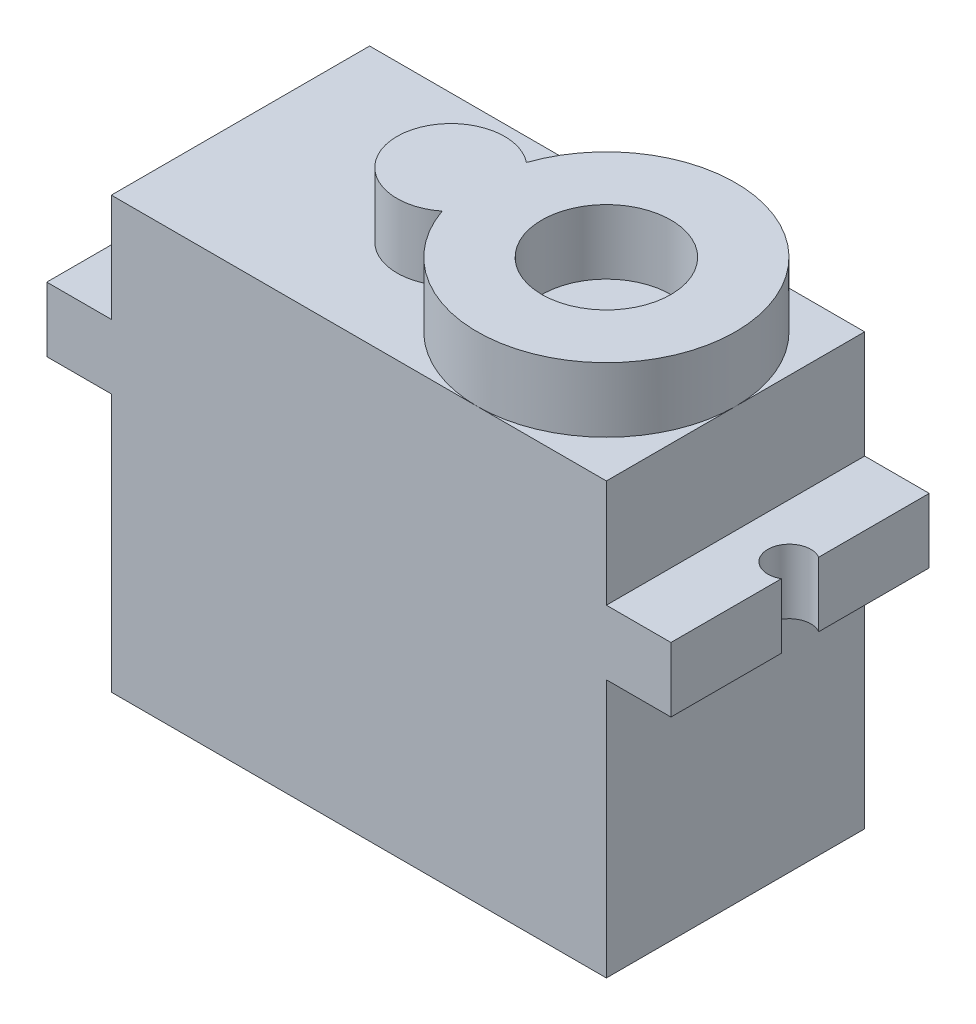
ISO-10303-21;
HEADER;
FILE_DESCRIPTION(('STEP AP214'),'2;1');
FILE_NAME('part.step','',(''),(''),'','','');
FILE_SCHEMA(('AUTOMOTIVE_DESIGN { 1 0 10303 214 1 1 1 1 }'));
ENDSEC;
DATA;
#1=APPLICATION_CONTEXT('core data for automotive mechanical design processes');
#2=APPLICATION_PROTOCOL_DEFINITION('international standard','automotive_design',2000,#1);
#3=PRODUCT_CONTEXT('',#1,'mechanical');
#4=PRODUCT('Part','Part','',(#3));
#5=PRODUCT_RELATED_PRODUCT_CATEGORY('part','',(#4));
#6=PRODUCT_DEFINITION_FORMATION('','',#4);
#7=PRODUCT_DEFINITION_CONTEXT('part definition',#1,'design');
#8=PRODUCT_DEFINITION('design','',#6,#7);
#9=PRODUCT_DEFINITION_SHAPE('','',#8);
#10=(LENGTH_UNIT() NAMED_UNIT(*) SI_UNIT(.MILLI.,.METRE.));
#11=(NAMED_UNIT(*) PLANE_ANGLE_UNIT() SI_UNIT($,.RADIAN.));
#12=(NAMED_UNIT(*) SI_UNIT($,.STERADIAN.) SOLID_ANGLE_UNIT());
#13=UNCERTAINTY_MEASURE_WITH_UNIT(LENGTH_MEASURE(1.E-05),#10,'distance_accuracy_value','');
#14=(GEOMETRIC_REPRESENTATION_CONTEXT(3) GLOBAL_UNCERTAINTY_ASSIGNED_CONTEXT((#13)) GLOBAL_UNIT_ASSIGNED_CONTEXT((#10,
#11,#12)) REPRESENTATION_CONTEXT('',''));
#15=CARTESIAN_POINT('',(0.,0.,0.));
#16=DIRECTION('',(0.,0.,1.));
#17=DIRECTION('',(1.,0.,0.));
#18=AXIS2_PLACEMENT_3D('',#15,#16,#17);
#19=CARTESIAN_POINT('',(0.,8.,6.));
#20=DIRECTION('',(0.,1.,0.));
#21=DIRECTION('',(0.,0.,1.));
#22=AXIS2_PLACEMENT_3D('',#19,#20,#21);
#23=PLANE('',#22);
#24=CARTESIAN_POINT('',(-1.72651780580471,8.,0.));
#25=DIRECTION('',(0.,1.,0.));
#26=DIRECTION('',(0.,0.,1.));
#27=AXIS2_PLACEMENT_3D('',#24,#25,#26);
#28=CIRCLE('',#27,2.5);
#29=CARTESIAN_POINT('',(-0.171650011833363,8.,-1.9576481152829));
#30=VERTEX_POINT('',#29);
#31=CARTESIAN_POINT('',(-0.171650011833363,8.,1.95764811528289));
#32=VERTEX_POINT('',#31);
#33=EDGE_CURVE('E198',#30,#32,#28,.T.);
#34=ORIENTED_EDGE('',*,*,#33,.F.);
#35=CARTESIAN_POINT('',(5.5,8.,0.));
#36=DIRECTION('',(0.,1.,0.));
#37=DIRECTION('',(0.,0.,1.));
#38=AXIS2_PLACEMENT_3D('',#35,#36,#37);
#39=CIRCLE('',#38,6.);
#40=CARTESIAN_POINT('',(5.5,8.,-6.));
#41=VERTEX_POINT('',#40);
#42=EDGE_CURVE('E422',#41,#30,#39,.T.);
#43=ORIENTED_EDGE('',*,*,#42,.F.);
#44=DIRECTION('',(1.,0.,0.));
#45=VECTOR('',#44,1.);
#46=CARTESIAN_POINT('',(0.,8.,-6.));
#47=LINE('',#46,#45);
#48=CARTESIAN_POINT('',(-11.5,8.,-6.));
#49=VERTEX_POINT('',#48);
#50=EDGE_CURVE('E352',#49,#41,#47,.T.);
#51=ORIENTED_EDGE('',*,*,#50,.F.);
#52=DIRECTION('',(0.,0.,-1.));
#53=VECTOR('',#52,1.);
#54=CARTESIAN_POINT('',(-11.5,8.,6.));
#55=LINE('',#54,#53);
#56=CARTESIAN_POINT('',(-11.5,8.,6.));
#57=VERTEX_POINT('',#56);
#58=EDGE_CURVE('E393',#57,#49,#55,.T.);
#59=ORIENTED_EDGE('',*,*,#58,.F.);
#60=DIRECTION('',(1.,0.,0.));
#61=VECTOR('',#60,1.);
#62=CARTESIAN_POINT('',(0.,8.,6.));
#63=LINE('',#62,#61);
#64=CARTESIAN_POINT('',(5.5,8.,6.));
#65=VERTEX_POINT('',#64);
#66=EDGE_CURVE('E312',#57,#65,#63,.T.);
#67=ORIENTED_EDGE('',*,*,#66,.T.);
#68=EDGE_CURVE('E53',#32,#65,#39,.T.);
#69=ORIENTED_EDGE('',*,*,#68,.F.);
#70=EDGE_LOOP('',(#34,#43,#51,#59,#67,#69));
#71=FACE_BOUND('',#70,.T.);
#72=ADVANCED_FACE('F41',(#71),#23,.T.);
#73=CARTESIAN_POINT('',(11.5,8.,0.));
#74=VERTEX_POINT('',#73);
#75=EDGE_CURVE('E11',#65,#74,#39,.T.);
#76=ORIENTED_EDGE('',*,*,#75,.F.);
#77=CARTESIAN_POINT('',(11.5,8.,6.));
#78=VERTEX_POINT('',#77);
#79=EDGE_CURVE('E311',#65,#78,#63,.T.);
#80=ORIENTED_EDGE('',*,*,#79,.T.);
#81=DIRECTION('',(0.,0.,-1.));
#82=VECTOR('',#81,1.);
#83=CARTESIAN_POINT('',(11.5,8.,6.));
#84=LINE('',#83,#82);
#85=EDGE_CURVE('E397',#78,#74,#84,.T.);
#86=ORIENTED_EDGE('',*,*,#85,.T.);
#87=EDGE_LOOP('',(#76,#80,#86));
#88=FACE_BOUND('',#87,.T.);
#89=ADVANCED_FACE('F452',(#88),#23,.T.);
#90=CARTESIAN_POINT('',(14.5,0.,6.));
#91=DIRECTION('',(-1.,0.,0.));
#92=DIRECTION('',(0.,-1.,0.));
#93=AXIS2_PLACEMENT_3D('',#90,#91,#92);
#94=PLANE('',#93);
#95=DIRECTION('',(0.,0.,-1.));
#96=VECTOR('',#95,1.);
#97=CARTESIAN_POINT('',(14.5,0.,6.));
#98=LINE('',#97,#96);
#99=CARTESIAN_POINT('',(14.5,0.,6.));
#100=VERTEX_POINT('',#99);
#101=CARTESIAN_POINT('',(14.5,0.,0.866025403784438));
#102=VERTEX_POINT('',#101);
#103=EDGE_CURVE('E410',#100,#102,#98,.T.);
#104=ORIENTED_EDGE('',*,*,#103,.T.);
#105=DIRECTION('',(0.,1.,0.));
#106=VECTOR('',#105,1.);
#107=CARTESIAN_POINT('',(14.5,-12.,0.866025403784434));
#108=LINE('',#107,#106);
#109=CARTESIAN_POINT('',(14.5,2.99999999999999,0.866025403784439));
#110=VERTEX_POINT('',#109);
#111=EDGE_CURVE('E285',#102,#110,#108,.T.);
#112=ORIENTED_EDGE('',*,*,#111,.T.);
#113=DIRECTION('',(0.,0.,-1.));
#114=VECTOR('',#113,1.);
#115=CARTESIAN_POINT('',(14.5,2.99999999999999,6.));
#116=LINE('',#115,#114);
#117=CARTESIAN_POINT('',(14.5,2.99999999999999,6.));
#118=VERTEX_POINT('',#117);
#119=EDGE_CURVE('E405',#118,#110,#116,.T.);
#120=ORIENTED_EDGE('',*,*,#119,.F.);
#121=DIRECTION('',(0.,1.,0.));
#122=VECTOR('',#121,1.);
#123=CARTESIAN_POINT('',(14.5,0.,6.));
#124=LINE('',#123,#122);
#125=EDGE_CURVE('E298',#100,#118,#124,.T.);
#126=ORIENTED_EDGE('',*,*,#125,.F.);
#127=EDGE_LOOP('',(#104,#112,#120,#126));
#128=FACE_BOUND('',#127,.T.);
#129=ADVANCED_FACE('F459',(#128),#94,.F.);
#130=CARTESIAN_POINT('',(-14.5,0.,6.));
#131=DIRECTION('',(-1.,0.,0.));
#132=DIRECTION('',(0.,-1.,0.));
#133=AXIS2_PLACEMENT_3D('',#130,#131,#132);
#134=PLANE('',#133);
#135=DIRECTION('',(0.,1.,0.));
#136=VECTOR('',#135,1.);
#137=CARTESIAN_POINT('',(-14.5,-12.,0.866025403784434));
#138=LINE('',#137,#136);
#139=CARTESIAN_POINT('',(-14.5,0.,0.866025403784438));
#140=VERTEX_POINT('',#139);
#141=CARTESIAN_POINT('',(-14.5,2.99999999999999,0.866025403784439));
#142=VERTEX_POINT('',#141);
#143=EDGE_CURVE('E274',#140,#142,#138,.T.);
#144=ORIENTED_EDGE('',*,*,#143,.F.);
#145=DIRECTION('',(0.,0.,-1.));
#146=VECTOR('',#145,1.);
#147=CARTESIAN_POINT('',(-14.5,0.,6.));
#148=LINE('',#147,#146);
#149=CARTESIAN_POINT('',(-14.5,0.,6.));
#150=VERTEX_POINT('',#149);
#151=EDGE_CURVE('E381',#150,#140,#148,.T.);
#152=ORIENTED_EDGE('',*,*,#151,.F.);
#153=DIRECTION('',(0.,1.,0.));
#154=VECTOR('',#153,1.);
#155=CARTESIAN_POINT('',(-14.5,0.,6.));
#156=LINE('',#155,#154);
#157=CARTESIAN_POINT('',(-14.5,2.99999999999999,6.));
#158=VERTEX_POINT('',#157);
#159=EDGE_CURVE('E319',#150,#158,#156,.T.);
#160=ORIENTED_EDGE('',*,*,#159,.T.);
#161=DIRECTION('',(0.,0.,-1.));
#162=VECTOR('',#161,1.);
#163=CARTESIAN_POINT('',(-14.5,2.99999999999999,6.));
#164=LINE('',#163,#162);
#165=EDGE_CURVE('E386',#158,#142,#164,.T.);
#166=ORIENTED_EDGE('',*,*,#165,.T.);
#167=EDGE_LOOP('',(#144,#152,#160,#166));
#168=FACE_BOUND('',#167,.T.);
#169=ADVANCED_FACE('F491',(#168),#134,.T.);
#170=CARTESIAN_POINT('',(11.5,0.,6.));
#171=DIRECTION('',(1.,0.,0.));
#172=DIRECTION('',(0.,0.,-1.));
#173=AXIS2_PLACEMENT_3D('',#170,#171,#172);
#174=PLANE('',#173);
#175=DIRECTION('',(0.,-1.,0.));
#176=VECTOR('',#175,1.);
#177=CARTESIAN_POINT('',(11.5,0.,-6.));
#178=LINE('',#177,#176);
#179=CARTESIAN_POINT('',(11.5,0.,-6.));
#180=VERTEX_POINT('',#179);
#181=CARTESIAN_POINT('',(11.5,-12.,-6.));
#182=VERTEX_POINT('',#181);
#183=EDGE_CURVE('E289',#180,#182,#178,.T.);
#184=ORIENTED_EDGE('',*,*,#183,.F.);
#185=DIRECTION('',(0.,0.,-1.));
#186=VECTOR('',#185,1.);
#187=CARTESIAN_POINT('',(11.5,0.,6.));
#188=LINE('',#187,#186);
#189=CARTESIAN_POINT('',(11.5,0.,6.));
#190=VERTEX_POINT('',#189);
#191=EDGE_CURVE('E414',#190,#180,#188,.T.);
#192=ORIENTED_EDGE('',*,*,#191,.F.);
#193=DIRECTION('',(0.,-1.,0.));
#194=VECTOR('',#193,1.);
#195=CARTESIAN_POINT('',(11.5,0.,6.));
#196=LINE('',#195,#194);
#197=CARTESIAN_POINT('',(11.5,-12.,6.));
#198=VERTEX_POINT('',#197);
#199=EDGE_CURVE('E290',#190,#198,#196,.T.);
#200=ORIENTED_EDGE('',*,*,#199,.T.);
#201=DIRECTION('',(0.,0.,-1.));
#202=VECTOR('',#201,1.);
#203=CARTESIAN_POINT('',(11.5,-12.,6.));
#204=LINE('',#203,#202);
#205=EDGE_CURVE('E329',#198,#182,#204,.T.);
#206=ORIENTED_EDGE('',*,*,#205,.T.);
#207=EDGE_LOOP('',(#184,#192,#200,#206));
#208=FACE_BOUND('',#207,.T.);
#209=ADVANCED_FACE('F43',(#208),#174,.T.);
#210=CARTESIAN_POINT('',(0.,0.,6.));
#211=DIRECTION('',(0.,1.,0.));
#212=DIRECTION('',(-1.,0.,0.));
#213=AXIS2_PLACEMENT_3D('',#210,#211,#212);
#214=PLANE('',#213);
#215=CARTESIAN_POINT('',(14.5,0.,-0.866025403784434));
#216=VERTEX_POINT('',#215);
#217=CARTESIAN_POINT('',(14.5,0.,-6.));
#218=VERTEX_POINT('',#217);
#219=EDGE_CURVE('E409',#216,#218,#98,.T.);
#220=ORIENTED_EDGE('',*,*,#219,.F.);
#221=CARTESIAN_POINT('',(14.,0.,0.));
#222=DIRECTION('',(0.,1.,0.));
#223=DIRECTION('',(-1.,0.,0.));
#224=AXIS2_PLACEMENT_3D('',#221,#222,#223);
#225=CIRCLE('',#224,1.);
#226=EDGE_CURVE('E281',#216,#102,#225,.T.);
#227=ORIENTED_EDGE('',*,*,#226,.T.);
#228=ORIENTED_EDGE('',*,*,#103,.F.);
#229=DIRECTION('',(1.,0.,0.));
#230=VECTOR('',#229,1.);
#231=CARTESIAN_POINT('',(0.,0.,6.));
#232=LINE('',#231,#230);
#233=EDGE_CURVE('E294',#190,#100,#232,.T.);
#234=ORIENTED_EDGE('',*,*,#233,.F.);
#235=ORIENTED_EDGE('',*,*,#191,.T.);
#236=DIRECTION('',(1.,0.,0.));
#237=VECTOR('',#236,1.);
#238=CARTESIAN_POINT('',(0.,0.,-6.));
#239=LINE('',#238,#237);
#240=EDGE_CURVE('E333',#180,#218,#239,.T.);
#241=ORIENTED_EDGE('',*,*,#240,.T.);
#242=EDGE_LOOP('',(#220,#227,#228,#234,#235,#241));
#243=FACE_BOUND('',#242,.T.);
#244=ADVANCED_FACE('F481',(#243),#214,.F.);
#245=CARTESIAN_POINT('',(14.5,2.99999999999999,-0.866025403784439));
#246=VERTEX_POINT('',#245);
#247=CARTESIAN_POINT('',(14.5,2.99999999999999,-6.));
#248=VERTEX_POINT('',#247);
#249=EDGE_CURVE('E404',#246,#248,#116,.T.);
#250=ORIENTED_EDGE('',*,*,#249,.F.);
#251=DIRECTION('',(0.,1.,0.));
#252=VECTOR('',#251,1.);
#253=CARTESIAN_POINT('',(14.5,-12.,-0.866025403784434));
#254=LINE('',#253,#252);
#255=EDGE_CURVE('E277',#246,#216,#254,.F.);
#256=ORIENTED_EDGE('',*,*,#255,.T.);
#257=ORIENTED_EDGE('',*,*,#219,.T.);
#258=DIRECTION('',(0.,1.,0.));
#259=VECTOR('',#258,1.);
#260=CARTESIAN_POINT('',(14.5,0.,-6.));
#261=LINE('',#260,#259);
#262=EDGE_CURVE('E337',#218,#248,#261,.T.);
#263=ORIENTED_EDGE('',*,*,#262,.T.);
#264=EDGE_LOOP('',(#250,#256,#257,#263));
#265=FACE_BOUND('',#264,.T.);
#266=ADVANCED_FACE('F477',(#265),#94,.F.);
#267=CARTESIAN_POINT('',(0.,2.99999999999999,6.));
#268=DIRECTION('',(0.,1.,0.));
#269=DIRECTION('',(0.,0.,1.));
#270=AXIS2_PLACEMENT_3D('',#267,#268,#269);
#271=PLANE('',#270);
#272=CARTESIAN_POINT('',(14.,2.99999999999999,0.));
#273=DIRECTION('',(0.,1.,0.));
#274=DIRECTION('',(0.,0.,1.));
#275=AXIS2_PLACEMENT_3D('',#272,#273,#274);
#276=CIRCLE('',#275,1.);
#277=EDGE_CURVE('E45',#246,#110,#276,.T.);
#278=ORIENTED_EDGE('',*,*,#277,.F.);
#279=ORIENTED_EDGE('',*,*,#249,.T.);
#280=DIRECTION('',(1.,0.,0.));
#281=VECTOR('',#280,1.);
#282=CARTESIAN_POINT('',(0.,2.99999999999999,-6.));
#283=LINE('',#282,#281);
#284=CARTESIAN_POINT('',(11.5,2.99999999999999,-6.));
#285=VERTEX_POINT('',#284);
#286=EDGE_CURVE('E342',#285,#248,#283,.T.);
#287=ORIENTED_EDGE('',*,*,#286,.F.);
#288=DIRECTION('',(0.,0.,-1.));
#289=VECTOR('',#288,1.);
#290=CARTESIAN_POINT('',(11.5,2.99999999999999,6.));
#291=LINE('',#290,#289);
#292=CARTESIAN_POINT('',(11.5,2.99999999999999,6.));
#293=VERTEX_POINT('',#292);
#294=EDGE_CURVE('E401',#293,#285,#291,.T.);
#295=ORIENTED_EDGE('',*,*,#294,.F.);
#296=DIRECTION('',(1.,0.,0.));
#297=VECTOR('',#296,1.);
#298=CARTESIAN_POINT('',(0.,2.99999999999999,6.));
#299=LINE('',#298,#297);
#300=EDGE_CURVE('E302',#293,#118,#299,.T.);
#301=ORIENTED_EDGE('',*,*,#300,.T.);
#302=ORIENTED_EDGE('',*,*,#119,.T.);
#303=EDGE_LOOP('',(#278,#279,#287,#295,#301,#302));
#304=FACE_BOUND('',#303,.T.);
#305=ADVANCED_FACE('F472',(#304),#271,.T.);
#306=CARTESIAN_POINT('',(11.5,0.,6.));
#307=DIRECTION('',(-1.,0.,0.));
#308=DIRECTION('',(0.,0.,1.));
#309=AXIS2_PLACEMENT_3D('',#306,#307,#308);
#310=PLANE('',#309);
#311=DIRECTION('',(0.,1.,0.));
#312=VECTOR('',#311,1.);
#313=CARTESIAN_POINT('',(11.5,0.,-6.));
#314=LINE('',#313,#312);
#315=CARTESIAN_POINT('',(11.5,8.,-6.));
#316=VERTEX_POINT('',#315);
#317=EDGE_CURVE('E346',#285,#316,#314,.T.);
#318=ORIENTED_EDGE('',*,*,#317,.T.);
#319=EDGE_CURVE('E396',#74,#316,#84,.T.);
#320=ORIENTED_EDGE('',*,*,#319,.F.);
#321=ORIENTED_EDGE('',*,*,#85,.F.);
#322=DIRECTION('',(0.,1.,0.));
#323=VECTOR('',#322,1.);
#324=CARTESIAN_POINT('',(11.5,0.,6.));
#325=LINE('',#324,#323);
#326=EDGE_CURVE('E306',#293,#78,#325,.T.);
#327=ORIENTED_EDGE('',*,*,#326,.F.);
#328=ORIENTED_EDGE('',*,*,#294,.T.);
#329=EDGE_LOOP('',(#318,#320,#321,#327,#328));
#330=FACE_BOUND('',#329,.T.);
#331=ADVANCED_FACE('F465',(#330),#310,.F.);
#332=EDGE_CURVE('E51',#74,#41,#39,.T.);
#333=ORIENTED_EDGE('',*,*,#332,.F.);
#334=ORIENTED_EDGE('',*,*,#319,.T.);
#335=EDGE_CURVE('E351',#41,#316,#47,.T.);
#336=ORIENTED_EDGE('',*,*,#335,.F.);
#337=EDGE_LOOP('',(#333,#334,#336));
#338=FACE_BOUND('',#337,.T.);
#339=ADVANCED_FACE('F451',(#338),#23,.T.);
#340=CARTESIAN_POINT('',(-11.5,0.,6.));
#341=DIRECTION('',(-1.,0.,0.));
#342=DIRECTION('',(0.,0.,1.));
#343=AXIS2_PLACEMENT_3D('',#340,#341,#342);
#344=PLANE('',#343);
#345=DIRECTION('',(0.,1.,0.));
#346=VECTOR('',#345,1.);
#347=CARTESIAN_POINT('',(-11.5,0.,-6.));
#348=LINE('',#347,#346);
#349=CARTESIAN_POINT('',(-11.5,2.99999999999999,-6.));
#350=VERTEX_POINT('',#349);
#351=EDGE_CURVE('E356',#350,#49,#348,.T.);
#352=ORIENTED_EDGE('',*,*,#351,.F.);
#353=DIRECTION('',(0.,0.,-1.));
#354=VECTOR('',#353,1.);
#355=CARTESIAN_POINT('',(-11.5,2.99999999999999,6.));
#356=LINE('',#355,#354);
#357=CARTESIAN_POINT('',(-11.5,2.99999999999999,6.));
#358=VERTEX_POINT('',#357);
#359=EDGE_CURVE('E390',#358,#350,#356,.T.);
#360=ORIENTED_EDGE('',*,*,#359,.F.);
#361=DIRECTION('',(0.,1.,0.));
#362=VECTOR('',#361,1.);
#363=CARTESIAN_POINT('',(-11.5,0.,6.));
#364=LINE('',#363,#362);
#365=EDGE_CURVE('E315',#358,#57,#364,.T.);
#366=ORIENTED_EDGE('',*,*,#365,.T.);
#367=ORIENTED_EDGE('',*,*,#58,.T.);
#368=EDGE_LOOP('',(#352,#360,#366,#367));
#369=FACE_BOUND('',#368,.T.);
#370=ADVANCED_FACE('F464',(#369),#344,.T.);
#371=CARTESIAN_POINT('',(-14.,2.99999999999999,0.));
#372=DIRECTION('',(0.,1.,0.));
#373=DIRECTION('',(0.,0.,-1.));
#374=AXIS2_PLACEMENT_3D('',#371,#372,#373);
#375=CIRCLE('',#374,1.);
#376=CARTESIAN_POINT('',(-14.5,2.99999999999999,-0.866025403784439));
#377=VERTEX_POINT('',#376);
#378=EDGE_CURVE('E265',#142,#377,#375,.T.);
#379=ORIENTED_EDGE('',*,*,#378,.F.);
#380=ORIENTED_EDGE('',*,*,#165,.F.);
#381=EDGE_CURVE('E307',#158,#358,#299,.T.);
#382=ORIENTED_EDGE('',*,*,#381,.T.);
#383=ORIENTED_EDGE('',*,*,#359,.T.);
#384=CARTESIAN_POINT('',(-14.5,2.99999999999999,-6.));
#385=VERTEX_POINT('',#384);
#386=EDGE_CURVE('E347',#385,#350,#283,.T.);
#387=ORIENTED_EDGE('',*,*,#386,.F.);
#388=EDGE_CURVE('E385',#377,#385,#164,.T.);
#389=ORIENTED_EDGE('',*,*,#388,.F.);
#390=EDGE_LOOP('',(#379,#380,#382,#383,#387,#389));
#391=FACE_BOUND('',#390,.T.);
#392=ADVANCED_FACE('F470',(#391),#271,.T.);
#393=DIRECTION('',(0.,1.,0.));
#394=VECTOR('',#393,1.);
#395=CARTESIAN_POINT('',(-14.5,-12.,-0.866025403784434));
#396=LINE('',#395,#394);
#397=CARTESIAN_POINT('',(-14.5,0.,-0.866025403784438));
#398=VERTEX_POINT('',#397);
#399=EDGE_CURVE('E271',#377,#398,#396,.F.);
#400=ORIENTED_EDGE('',*,*,#399,.F.);
#401=ORIENTED_EDGE('',*,*,#388,.T.);
#402=DIRECTION('',(0.,1.,0.));
#403=VECTOR('',#402,1.);
#404=CARTESIAN_POINT('',(-14.5,0.,-6.));
#405=LINE('',#404,#403);
#406=CARTESIAN_POINT('',(-14.5,0.,-6.));
#407=VERTEX_POINT('',#406);
#408=EDGE_CURVE('E360',#407,#385,#405,.T.);
#409=ORIENTED_EDGE('',*,*,#408,.F.);
#410=EDGE_CURVE('E380',#398,#407,#148,.T.);
#411=ORIENTED_EDGE('',*,*,#410,.F.);
#412=EDGE_LOOP('',(#400,#401,#409,#411));
#413=FACE_BOUND('',#412,.T.);
#414=ADVANCED_FACE('F498',(#413),#134,.T.);
#415=ORIENTED_EDGE('',*,*,#151,.T.);
#416=CARTESIAN_POINT('',(-14.,0.,0.));
#417=DIRECTION('',(0.,1.,0.));
#418=DIRECTION('',(-1.,0.,0.));
#419=AXIS2_PLACEMENT_3D('',#416,#417,#418);
#420=CIRCLE('',#419,1.);
#421=EDGE_CURVE('E416',#140,#398,#420,.T.);
#422=ORIENTED_EDGE('',*,*,#421,.T.);
#423=ORIENTED_EDGE('',*,*,#410,.T.);
#424=CARTESIAN_POINT('',(-11.5,0.,-6.));
#425=VERTEX_POINT('',#424);
#426=EDGE_CURVE('E338',#407,#425,#239,.T.);
#427=ORIENTED_EDGE('',*,*,#426,.T.);
#428=DIRECTION('',(0.,0.,-1.));
#429=VECTOR('',#428,1.);
#430=CARTESIAN_POINT('',(-11.5,0.,6.));
#431=LINE('',#430,#429);
#432=CARTESIAN_POINT('',(-11.5,0.,6.));
#433=VERTEX_POINT('',#432);
#434=EDGE_CURVE('E376',#433,#425,#431,.T.);
#435=ORIENTED_EDGE('',*,*,#434,.F.);
#436=EDGE_CURVE('E299',#150,#433,#232,.T.);
#437=ORIENTED_EDGE('',*,*,#436,.F.);
#438=EDGE_LOOP('',(#415,#422,#423,#427,#435,#437));
#439=FACE_BOUND('',#438,.T.);
#440=ADVANCED_FACE('F488',(#439),#214,.F.);
#441=CARTESIAN_POINT('',(-11.5,0.,6.));
#442=DIRECTION('',(1.,0.,0.));
#443=DIRECTION('',(0.,0.,-1.));
#444=AXIS2_PLACEMENT_3D('',#441,#442,#443);
#445=PLANE('',#444);
#446=DIRECTION('',(0.,-1.,0.));
#447=VECTOR('',#446,1.);
#448=CARTESIAN_POINT('',(-11.5,0.,-6.));
#449=LINE('',#448,#447);
#450=CARTESIAN_POINT('',(-11.5,-12.,-6.));
#451=VERTEX_POINT('',#450);
#452=EDGE_CURVE('E364',#425,#451,#449,.T.);
#453=ORIENTED_EDGE('',*,*,#452,.T.);
#454=DIRECTION('',(0.,0.,-1.));
#455=VECTOR('',#454,1.);
#456=CARTESIAN_POINT('',(-11.5,-12.,6.));
#457=LINE('',#456,#455);
#458=CARTESIAN_POINT('',(-11.5,-12.,6.));
#459=VERTEX_POINT('',#458);
#460=EDGE_CURVE('E372',#459,#451,#457,.T.);
#461=ORIENTED_EDGE('',*,*,#460,.F.);
#462=DIRECTION('',(0.,-1.,0.));
#463=VECTOR('',#462,1.);
#464=CARTESIAN_POINT('',(-11.5,0.,6.));
#465=LINE('',#464,#463);
#466=EDGE_CURVE('E323',#433,#459,#465,.T.);
#467=ORIENTED_EDGE('',*,*,#466,.F.);
#468=ORIENTED_EDGE('',*,*,#434,.T.);
#469=EDGE_LOOP('',(#453,#461,#467,#468));
#470=FACE_BOUND('',#469,.T.);
#471=ADVANCED_FACE('F542',(#470),#445,.F.);
#472=CARTESIAN_POINT('',(0.,-12.,6.));
#473=DIRECTION('',(0.,1.,0.));
#474=DIRECTION('',(-1.,0.,0.));
#475=AXIS2_PLACEMENT_3D('',#472,#473,#474);
#476=PLANE('',#475);
#477=CARTESIAN_POINT('',(9.5,-12.,4.));
#478=DIRECTION('',(0.,-1.,0.));
#479=DIRECTION('',(-1.,0.,0.));
#480=AXIS2_PLACEMENT_3D('',#477,#478,#479);
#481=CIRCLE('',#480,1.25);
#482=CARTESIAN_POINT('',(8.25,-12.,4.));
#483=VERTEX_POINT('',#482);
#484=EDGE_CURVE('E250',#483,#483,#481,.T.);
#485=ORIENTED_EDGE('',*,*,#484,.F.);
#486=EDGE_LOOP('',(#485));
#487=FACE_BOUND('',#486,.T.);
#488=CARTESIAN_POINT('',(-9.5,-12.,-4.));
#489=DIRECTION('',(0.,-1.,0.));
#490=DIRECTION('',(-1.,0.,0.));
#491=AXIS2_PLACEMENT_3D('',#488,#489,#490);
#492=CIRCLE('',#491,1.25);
#493=CARTESIAN_POINT('',(-10.75,-12.,-4.));
#494=VERTEX_POINT('',#493);
#495=EDGE_CURVE('E241',#494,#494,#492,.T.);
#496=ORIENTED_EDGE('',*,*,#495,.F.);
#497=EDGE_LOOP('',(#496));
#498=FACE_BOUND('',#497,.T.);
#499=CARTESIAN_POINT('',(-9.5,-12.,4.));
#500=DIRECTION('',(0.,-1.,0.));
#501=DIRECTION('',(1.,0.,0.));
#502=AXIS2_PLACEMENT_3D('',#499,#500,#501);
#503=CIRCLE('',#502,1.25);
#504=CARTESIAN_POINT('',(-8.25,-12.,4.));
#505=VERTEX_POINT('',#504);
#506=EDGE_CURVE('E236',#505,#505,#503,.T.);
#507=ORIENTED_EDGE('',*,*,#506,.F.);
#508=EDGE_LOOP('',(#507));
#509=FACE_BOUND('',#508,.T.);
#510=CARTESIAN_POINT('',(9.5,-12.,-4.));
#511=DIRECTION('',(0.,-1.,0.));
#512=DIRECTION('',(1.,0.,0.));
#513=AXIS2_PLACEMENT_3D('',#510,#511,#512);
#514=CIRCLE('',#513,1.25);
#515=CARTESIAN_POINT('',(10.75,-12.,-4.));
#516=VERTEX_POINT('',#515);
#517=EDGE_CURVE('E249',#516,#516,#514,.T.);
#518=ORIENTED_EDGE('',*,*,#517,.F.);
#519=EDGE_LOOP('',(#518));
#520=FACE_BOUND('',#519,.T.);
#521=DIRECTION('',(1.,0.,0.));
#522=VECTOR('',#521,1.);
#523=CARTESIAN_POINT('',(0.,-12.,-6.));
#524=LINE('',#523,#522);
#525=EDGE_CURVE('E295',#451,#182,#524,.T.);
#526=ORIENTED_EDGE('',*,*,#525,.T.);
#527=ORIENTED_EDGE('',*,*,#205,.F.);
#528=DIRECTION('',(1.,0.,0.));
#529=VECTOR('',#528,1.);
#530=CARTESIAN_POINT('',(0.,-12.,6.));
#531=LINE('',#530,#529);
#532=EDGE_CURVE('E326',#459,#198,#531,.T.);
#533=ORIENTED_EDGE('',*,*,#532,.F.);
#534=ORIENTED_EDGE('',*,*,#460,.T.);
#535=EDGE_LOOP('',(#526,#527,#533,#534));
#536=FACE_BOUND('',#535,.T.);
#537=ADVANCED_FACE('F536',(#487,#498,#509,#520,#536),#476,.F.);
#538=CARTESIAN_POINT('',(0.,0.,6.));
#539=DIRECTION('',(0.,0.,1.));
#540=DIRECTION('',(1.,0.,0.));
#541=AXIS2_PLACEMENT_3D('',#538,#539,#540);
#542=PLANE('',#541);
#543=ORIENTED_EDGE('',*,*,#199,.F.);
#544=ORIENTED_EDGE('',*,*,#233,.T.);
#545=ORIENTED_EDGE('',*,*,#125,.T.);
#546=ORIENTED_EDGE('',*,*,#300,.F.);
#547=ORIENTED_EDGE('',*,*,#326,.T.);
#548=ORIENTED_EDGE('',*,*,#79,.F.);
#549=ORIENTED_EDGE('',*,*,#66,.F.);
#550=ORIENTED_EDGE('',*,*,#365,.F.);
#551=ORIENTED_EDGE('',*,*,#381,.F.);
#552=ORIENTED_EDGE('',*,*,#159,.F.);
#553=ORIENTED_EDGE('',*,*,#436,.T.);
#554=ORIENTED_EDGE('',*,*,#466,.T.);
#555=ORIENTED_EDGE('',*,*,#532,.T.);
#556=EDGE_LOOP('',(#543,#544,#545,#546,#547,#548,#549,#550,#551,#552,#553,#554,#555));
#557=FACE_BOUND('',#556,.T.);
#558=ADVANCED_FACE('F559',(#557),#542,.T.);
#559=CARTESIAN_POINT('',(0.,0.,-6.));
#560=DIRECTION('',(0.,0.,1.));
#561=DIRECTION('',(1.,0.,0.));
#562=AXIS2_PLACEMENT_3D('',#559,#560,#561);
#563=PLANE('',#562);
#564=ORIENTED_EDGE('',*,*,#183,.T.);
#565=ORIENTED_EDGE('',*,*,#525,.F.);
#566=ORIENTED_EDGE('',*,*,#452,.F.);
#567=ORIENTED_EDGE('',*,*,#426,.F.);
#568=ORIENTED_EDGE('',*,*,#408,.T.);
#569=ORIENTED_EDGE('',*,*,#386,.T.);
#570=ORIENTED_EDGE('',*,*,#351,.T.);
#571=ORIENTED_EDGE('',*,*,#50,.T.);
#572=ORIENTED_EDGE('',*,*,#335,.T.);
#573=ORIENTED_EDGE('',*,*,#317,.F.);
#574=ORIENTED_EDGE('',*,*,#286,.T.);
#575=ORIENTED_EDGE('',*,*,#262,.F.);
#576=ORIENTED_EDGE('',*,*,#240,.F.);
#577=EDGE_LOOP('',(#564,#565,#566,#567,#568,#569,#570,#571,#572,#573,#574,#575,#576));
#578=FACE_BOUND('',#577,.T.);
#579=ADVANCED_FACE('F524',(#578),#563,.F.);
#580=CARTESIAN_POINT('',(-14.,-12.,0.));
#581=DIRECTION('',(0.,1.,0.));
#582=DIRECTION('',(0.,0.,1.));
#583=AXIS2_PLACEMENT_3D('',#580,#581,#582);
#584=CYLINDRICAL_SURFACE('',#583,1.);
#585=ORIENTED_EDGE('',*,*,#143,.T.);
#586=ORIENTED_EDGE('',*,*,#378,.T.);
#587=ORIENTED_EDGE('',*,*,#399,.T.);
#588=ORIENTED_EDGE('',*,*,#421,.F.);
#589=EDGE_LOOP('',(#585,#586,#587,#588));
#590=FACE_BOUND('',#589,.T.);
#591=ADVANCED_FACE('F562',(#590),#584,.F.);
#592=CARTESIAN_POINT('',(14.,-12.,0.));
#593=DIRECTION('',(0.,1.,0.));
#594=DIRECTION('',(0.,0.,1.));
#595=AXIS2_PLACEMENT_3D('',#592,#593,#594);
#596=CYLINDRICAL_SURFACE('',#595,1.);
#597=ORIENTED_EDGE('',*,*,#226,.F.);
#598=ORIENTED_EDGE('',*,*,#255,.F.);
#599=ORIENTED_EDGE('',*,*,#277,.T.);
#600=ORIENTED_EDGE('',*,*,#111,.F.);
#601=EDGE_LOOP('',(#597,#598,#599,#600));
#602=FACE_BOUND('',#601,.T.);
#603=ADVANCED_FACE('F505',(#602),#596,.F.);
#604=CARTESIAN_POINT('',(9.5,-11.5,-4.));
#605=DIRECTION('',(0.,-1.,0.));
#606=DIRECTION('',(1.,0.,0.));
#607=AXIS2_PLACEMENT_3D('',#604,#605,#606);
#608=CYLINDRICAL_SURFACE('',#607,1.25);
#609=CARTESIAN_POINT('',(9.5,-11.5,-4.));
#610=DIRECTION('',(0.,-1.,0.));
#611=DIRECTION('',(1.,0.,0.));
#612=AXIS2_PLACEMENT_3D('',#609,#610,#611);
#613=CIRCLE('',#612,1.25);
#614=CARTESIAN_POINT('',(10.75,-11.5,-4.));
#615=VERTEX_POINT('',#614);
#616=EDGE_CURVE('E261',#615,#615,#613,.T.);
#617=ORIENTED_EDGE('',*,*,#616,.F.);
#618=EDGE_LOOP('',(#617));
#619=FACE_BOUND('',#618,.T.);
#620=ORIENTED_EDGE('',*,*,#517,.T.);
#621=EDGE_LOOP('',(#620));
#622=FACE_BOUND('',#621,.T.);
#623=ADVANCED_FACE('F569',(#619,#622),#608,.F.);
#624=CARTESIAN_POINT('',(9.5,-11.5,-4.));
#625=DIRECTION('',(0.,-1.,0.));
#626=DIRECTION('',(1.,0.,0.));
#627=AXIS2_PLACEMENT_3D('',#624,#625,#626);
#628=PLANE('',#627);
#629=CARTESIAN_POINT('',(9.5,-11.5,-4.));
#630=DIRECTION('',(0.,-1.,0.));
#631=DIRECTION('',(1.,0.,0.));
#632=AXIS2_PLACEMENT_3D('',#629,#630,#631);
#633=CIRCLE('',#632,1.);
#634=CARTESIAN_POINT('',(10.5,-11.5,-4.));
#635=VERTEX_POINT('',#634);
#636=EDGE_CURVE('E232',#635,#635,#633,.T.);
#637=ORIENTED_EDGE('',*,*,#636,.F.);
#638=EDGE_LOOP('',(#637));
#639=FACE_BOUND('',#638,.T.);
#640=ORIENTED_EDGE('',*,*,#616,.T.);
#641=EDGE_LOOP('',(#640));
#642=FACE_BOUND('',#641,.T.);
#643=ADVANCED_FACE('F796',(#639,#642),#628,.T.);
#644=CARTESIAN_POINT('',(-9.5,-11.5,4.));
#645=DIRECTION('',(0.,-1.,0.));
#646=DIRECTION('',(1.,0.,0.));
#647=AXIS2_PLACEMENT_3D('',#644,#645,#646);
#648=CYLINDRICAL_SURFACE('',#647,1.25);
#649=CARTESIAN_POINT('',(-9.5,-11.5,4.));
#650=DIRECTION('',(0.,-1.,0.));
#651=DIRECTION('',(1.,0.,0.));
#652=AXIS2_PLACEMENT_3D('',#649,#650,#651);
#653=CIRCLE('',#652,1.25);
#654=CARTESIAN_POINT('',(-8.25,-11.5,4.));
#655=VERTEX_POINT('',#654);
#656=EDGE_CURVE('E237',#655,#655,#653,.T.);
#657=ORIENTED_EDGE('',*,*,#656,.F.);
#658=EDGE_LOOP('',(#657));
#659=FACE_BOUND('',#658,.T.);
#660=ORIENTED_EDGE('',*,*,#506,.T.);
#661=EDGE_LOOP('',(#660));
#662=FACE_BOUND('',#661,.T.);
#663=ADVANCED_FACE('F786',(#659,#662),#648,.F.);
#664=CARTESIAN_POINT('',(-9.5,-11.5,4.));
#665=DIRECTION('',(0.,-1.,0.));
#666=DIRECTION('',(1.,0.,0.));
#667=AXIS2_PLACEMENT_3D('',#664,#665,#666);
#668=PLANE('',#667);
#669=CARTESIAN_POINT('',(-9.5,-11.5,4.));
#670=DIRECTION('',(0.,-1.,0.));
#671=DIRECTION('',(1.,0.,0.));
#672=AXIS2_PLACEMENT_3D('',#669,#670,#671);
#673=CIRCLE('',#672,1.);
#674=CARTESIAN_POINT('',(-8.5,-11.5,4.));
#675=VERTEX_POINT('',#674);
#676=EDGE_CURVE('E228',#675,#675,#673,.T.);
#677=ORIENTED_EDGE('',*,*,#676,.F.);
#678=EDGE_LOOP('',(#677));
#679=FACE_BOUND('',#678,.T.);
#680=ORIENTED_EDGE('',*,*,#656,.T.);
#681=EDGE_LOOP('',(#680));
#682=FACE_BOUND('',#681,.T.);
#683=ADVANCED_FACE('F776',(#679,#682),#668,.T.);
#684=CARTESIAN_POINT('',(-9.5,-11.5,-4.));
#685=DIRECTION('',(0.,-1.,0.));
#686=DIRECTION('',(1.,0.,0.));
#687=AXIS2_PLACEMENT_3D('',#684,#685,#686);
#688=CYLINDRICAL_SURFACE('',#687,1.25);
#689=CARTESIAN_POINT('',(-9.5,-11.5,-4.));
#690=DIRECTION('',(0.,-1.,0.));
#691=DIRECTION('',(-1.,0.,0.));
#692=AXIS2_PLACEMENT_3D('',#689,#690,#691);
#693=CIRCLE('',#692,1.25);
#694=CARTESIAN_POINT('',(-10.75,-11.5,-4.));
#695=VERTEX_POINT('',#694);
#696=EDGE_CURVE('E254',#695,#695,#693,.T.);
#697=ORIENTED_EDGE('',*,*,#696,.F.);
#698=EDGE_LOOP('',(#697));
#699=FACE_BOUND('',#698,.T.);
#700=ORIENTED_EDGE('',*,*,#495,.T.);
#701=EDGE_LOOP('',(#700));
#702=FACE_BOUND('',#701,.T.);
#703=ADVANCED_FACE('F766',(#699,#702),#688,.F.);
#704=CARTESIAN_POINT('',(-9.5,-11.5,-4.));
#705=DIRECTION('',(0.,1.,0.));
#706=DIRECTION('',(-1.,0.,0.));
#707=AXIS2_PLACEMENT_3D('',#704,#705,#706);
#708=PLANE('',#707);
#709=CARTESIAN_POINT('',(-9.5,-11.5,-4.));
#710=DIRECTION('',(0.,1.,0.));
#711=DIRECTION('',(-1.,0.,0.));
#712=AXIS2_PLACEMENT_3D('',#709,#710,#711);
#713=CIRCLE('',#712,1.);
#714=CARTESIAN_POINT('',(-10.5,-11.5,-4.));
#715=VERTEX_POINT('',#714);
#716=EDGE_CURVE('E224',#715,#715,#713,.F.);
#717=ORIENTED_EDGE('',*,*,#716,.F.);
#718=EDGE_LOOP('',(#717));
#719=FACE_BOUND('',#718,.T.);
#720=ORIENTED_EDGE('',*,*,#696,.T.);
#721=EDGE_LOOP('',(#720));
#722=FACE_BOUND('',#721,.T.);
#723=ADVANCED_FACE('F756',(#719,#722),#708,.F.);
#724=CARTESIAN_POINT('',(9.5,-11.5,4.));
#725=DIRECTION('',(0.,-1.,0.));
#726=DIRECTION('',(1.,0.,0.));
#727=AXIS2_PLACEMENT_3D('',#724,#725,#726);
#728=CYLINDRICAL_SURFACE('',#727,1.25);
#729=CARTESIAN_POINT('',(9.5,-11.5,4.));
#730=DIRECTION('',(0.,-1.,0.));
#731=DIRECTION('',(-1.,0.,0.));
#732=AXIS2_PLACEMENT_3D('',#729,#730,#731);
#733=CIRCLE('',#732,1.25);
#734=CARTESIAN_POINT('',(8.25,-11.5,4.));
#735=VERTEX_POINT('',#734);
#736=EDGE_CURVE('E245',#735,#735,#733,.T.);
#737=ORIENTED_EDGE('',*,*,#736,.F.);
#738=EDGE_LOOP('',(#737));
#739=FACE_BOUND('',#738,.T.);
#740=ORIENTED_EDGE('',*,*,#484,.T.);
#741=EDGE_LOOP('',(#740));
#742=FACE_BOUND('',#741,.T.);
#743=ADVANCED_FACE('F746',(#739,#742),#728,.F.);
#744=CARTESIAN_POINT('',(9.5,-11.5,4.));
#745=DIRECTION('',(0.,1.,0.));
#746=DIRECTION('',(-1.,0.,0.));
#747=AXIS2_PLACEMENT_3D('',#744,#745,#746);
#748=PLANE('',#747);
#749=CARTESIAN_POINT('',(9.5,-11.5,4.));
#750=DIRECTION('',(0.,1.,0.));
#751=DIRECTION('',(-1.,0.,0.));
#752=AXIS2_PLACEMENT_3D('',#749,#750,#751);
#753=CIRCLE('',#752,1.);
#754=CARTESIAN_POINT('',(8.5,-11.5,4.));
#755=VERTEX_POINT('',#754);
#756=EDGE_CURVE('E220',#755,#755,#753,.F.);
#757=ORIENTED_EDGE('',*,*,#756,.F.);
#758=EDGE_LOOP('',(#757));
#759=FACE_BOUND('',#758,.T.);
#760=ORIENTED_EDGE('',*,*,#736,.T.);
#761=EDGE_LOOP('',(#760));
#762=FACE_BOUND('',#761,.T.);
#763=ADVANCED_FACE('F736',(#759,#762),#748,.F.);
#764=CARTESIAN_POINT('',(9.5,0.,4.));
#765=DIRECTION('',(0.,-1.,0.));
#766=DIRECTION('',(1.,0.,0.));
#767=AXIS2_PLACEMENT_3D('',#764,#765,#766);
#768=CYLINDRICAL_SURFACE('',#767,1.);
#769=CARTESIAN_POINT('',(9.5,0.,4.));
#770=DIRECTION('',(0.,-1.,0.));
#771=DIRECTION('',(1.,0.,0.));
#772=AXIS2_PLACEMENT_3D('',#769,#770,#771);
#773=CIRCLE('',#772,1.);
#774=CARTESIAN_POINT('',(10.5,0.,4.));
#775=VERTEX_POINT('',#774);
#776=EDGE_CURVE('E205',#775,#775,#773,.F.);
#777=ORIENTED_EDGE('',*,*,#776,.T.);
#778=EDGE_LOOP('',(#777));
#779=FACE_BOUND('',#778,.T.);
#780=ORIENTED_EDGE('',*,*,#756,.T.);
#781=EDGE_LOOP('',(#780));
#782=FACE_BOUND('',#781,.T.);
#783=ADVANCED_FACE('F726',(#779,#782),#768,.F.);
#784=CARTESIAN_POINT('',(0.,0.,0.));
#785=DIRECTION('',(0.,-1.,0.));
#786=DIRECTION('',(1.,0.,0.));
#787=AXIS2_PLACEMENT_3D('',#784,#785,#786);
#788=PLANE('',#787);
#789=ORIENTED_EDGE('',*,*,#776,.F.);
#790=EDGE_LOOP('',(#789));
#791=FACE_BOUND('',#790,.T.);
#792=ADVANCED_FACE('F716',(#791),#788,.T.);
#793=CARTESIAN_POINT('',(-9.5,0.,-4.));
#794=DIRECTION('',(0.,-1.,0.));
#795=DIRECTION('',(1.,0.,0.));
#796=AXIS2_PLACEMENT_3D('',#793,#794,#795);
#797=CYLINDRICAL_SURFACE('',#796,1.);
#798=CARTESIAN_POINT('',(-9.5,0.,-4.));
#799=DIRECTION('',(0.,-1.,0.));
#800=DIRECTION('',(1.,0.,0.));
#801=AXIS2_PLACEMENT_3D('',#798,#799,#800);
#802=CIRCLE('',#801,1.);
#803=CARTESIAN_POINT('',(-8.5,0.,-4.));
#804=VERTEX_POINT('',#803);
#805=EDGE_CURVE('E213',#804,#804,#802,.F.);
#806=ORIENTED_EDGE('',*,*,#805,.T.);
#807=EDGE_LOOP('',(#806));
#808=FACE_BOUND('',#807,.T.);
#809=ORIENTED_EDGE('',*,*,#716,.T.);
#810=EDGE_LOOP('',(#809));
#811=FACE_BOUND('',#810,.T.);
#812=ADVANCED_FACE('F706',(#808,#811),#797,.F.);
#813=CARTESIAN_POINT('',(0.,0.,0.));
#814=DIRECTION('',(0.,-1.,0.));
#815=DIRECTION('',(1.,0.,0.));
#816=AXIS2_PLACEMENT_3D('',#813,#814,#815);
#817=PLANE('',#816);
#818=ORIENTED_EDGE('',*,*,#805,.F.);
#819=EDGE_LOOP('',(#818));
#820=FACE_BOUND('',#819,.T.);
#821=ADVANCED_FACE('F696',(#820),#817,.T.);
#822=CARTESIAN_POINT('',(-9.5,0.,4.));
#823=DIRECTION('',(0.,-1.,0.));
#824=DIRECTION('',(1.,0.,0.));
#825=AXIS2_PLACEMENT_3D('',#822,#823,#824);
#826=CYLINDRICAL_SURFACE('',#825,1.);
#827=ORIENTED_EDGE('',*,*,#676,.T.);
#828=EDGE_LOOP('',(#827));
#829=FACE_BOUND('',#828,.T.);
#830=CARTESIAN_POINT('',(-9.5,0.,4.));
#831=DIRECTION('',(0.,-1.,0.));
#832=DIRECTION('',(1.,0.,0.));
#833=AXIS2_PLACEMENT_3D('',#830,#831,#832);
#834=CIRCLE('',#833,1.);
#835=CARTESIAN_POINT('',(-8.5,0.,4.));
#836=VERTEX_POINT('',#835);
#837=EDGE_CURVE('E209',#836,#836,#834,.T.);
#838=ORIENTED_EDGE('',*,*,#837,.F.);
#839=EDGE_LOOP('',(#838));
#840=FACE_BOUND('',#839,.T.);
#841=ADVANCED_FACE('F686',(#829,#840),#826,.F.);
#842=CARTESIAN_POINT('',(0.,0.,0.));
#843=DIRECTION('',(0.,-1.,0.));
#844=DIRECTION('',(1.,0.,0.));
#845=AXIS2_PLACEMENT_3D('',#842,#843,#844);
#846=PLANE('',#845);
#847=ORIENTED_EDGE('',*,*,#837,.T.);
#848=EDGE_LOOP('',(#847));
#849=FACE_BOUND('',#848,.T.);
#850=ADVANCED_FACE('F676',(#849),#846,.T.);
#851=CARTESIAN_POINT('',(9.5,0.,-4.));
#852=DIRECTION('',(0.,-1.,0.));
#853=DIRECTION('',(1.,0.,0.));
#854=AXIS2_PLACEMENT_3D('',#851,#852,#853);
#855=CYLINDRICAL_SURFACE('',#854,1.);
#856=ORIENTED_EDGE('',*,*,#636,.T.);
#857=EDGE_LOOP('',(#856));
#858=FACE_BOUND('',#857,.T.);
#859=CARTESIAN_POINT('',(9.5,0.,-4.));
#860=DIRECTION('',(0.,-1.,0.));
#861=DIRECTION('',(1.,0.,0.));
#862=AXIS2_PLACEMENT_3D('',#859,#860,#861);
#863=CIRCLE('',#862,1.);
#864=CARTESIAN_POINT('',(10.5,0.,-4.));
#865=VERTEX_POINT('',#864);
#866=EDGE_CURVE('E200',#865,#865,#863,.T.);
#867=ORIENTED_EDGE('',*,*,#866,.F.);
#868=EDGE_LOOP('',(#867));
#869=FACE_BOUND('',#868,.T.);
#870=ADVANCED_FACE('F669',(#858,#869),#855,.F.);
#871=CARTESIAN_POINT('',(0.,0.,0.));
#872=DIRECTION('',(0.,-1.,0.));
#873=DIRECTION('',(1.,0.,0.));
#874=AXIS2_PLACEMENT_3D('',#871,#872,#873);
#875=PLANE('',#874);
#876=ORIENTED_EDGE('',*,*,#866,.T.);
#877=EDGE_LOOP('',(#876));
#878=FACE_BOUND('',#877,.T.);
#879=ADVANCED_FACE('F625',(#878),#875,.T.);
#880=CARTESIAN_POINT('',(1.88674109709764,11.,0.));
#881=DIRECTION('',(0.,1.,0.));
#882=DIRECTION('',(0.,0.,1.));
#883=AXIS2_PLACEMENT_3D('',#880,#881,#882);
#884=PLANE('',#883);
#885=CARTESIAN_POINT('',(-1.72651780580471,11.,0.));
#886=DIRECTION('',(0.,1.,0.));
#887=DIRECTION('',(0.,0.,1.));
#888=AXIS2_PLACEMENT_3D('',#885,#886,#887);
#889=CIRCLE('',#888,2.5);
#890=CARTESIAN_POINT('',(-0.171650011833363,11.,-1.9576481152829));
#891=VERTEX_POINT('',#890);
#892=CARTESIAN_POINT('',(-0.171650011833363,11.,1.95764811528289));
#893=VERTEX_POINT('',#892);
#894=EDGE_CURVE('E190',#891,#893,#889,.T.);
#895=ORIENTED_EDGE('',*,*,#894,.T.);
#896=CARTESIAN_POINT('',(5.5,11.,0.));
#897=DIRECTION('',(0.,1.,0.));
#898=DIRECTION('',(0.,0.,1.));
#899=AXIS2_PLACEMENT_3D('',#896,#897,#898);
#900=CIRCLE('',#899,6.);
#901=EDGE_CURVE('E178',#893,#891,#900,.T.);
#902=ORIENTED_EDGE('',*,*,#901,.T.);
#903=EDGE_LOOP('',(#895,#902));
#904=FACE_BOUND('',#903,.T.);
#905=CARTESIAN_POINT('',(5.5,11.,0.));
#906=DIRECTION('',(0.,1.,0.));
#907=DIRECTION('',(0.,0.,1.));
#908=AXIS2_PLACEMENT_3D('',#905,#906,#907);
#909=CIRCLE('',#908,3.);
#910=CARTESIAN_POINT('',(5.5,11.,3.));
#911=VERTEX_POINT('',#910);
#912=EDGE_CURVE('E430',#911,#911,#909,.T.);
#913=ORIENTED_EDGE('',*,*,#912,.F.);
#914=EDGE_LOOP('',(#913));
#915=FACE_BOUND('',#914,.T.);
#916=ADVANCED_FACE('F192',(#904,#915),#884,.T.);
#917=CARTESIAN_POINT('',(-1.72651780580471,11.,0.));
#918=DIRECTION('',(0.,-1.,0.));
#919=DIRECTION('',(0.,0.,-1.));
#920=AXIS2_PLACEMENT_3D('',#917,#918,#919);
#921=CYLINDRICAL_SURFACE('',#920,2.5);
#922=ORIENTED_EDGE('',*,*,#33,.T.);
#923=DIRECTION('',(0.,-1.,0.));
#924=VECTOR('',#923,1.);
#925=CARTESIAN_POINT('',(-0.171650011833363,11.,1.95764811528289));
#926=LINE('',#925,#924);
#927=EDGE_CURVE('E182',#893,#32,#926,.T.);
#928=ORIENTED_EDGE('',*,*,#927,.F.);
#929=ORIENTED_EDGE('',*,*,#894,.F.);
#930=DIRECTION('',(0.,-1.,0.));
#931=VECTOR('',#930,1.);
#932=CARTESIAN_POINT('',(-0.171650011833363,11.,-1.9576481152829));
#933=LINE('',#932,#931);
#934=EDGE_CURVE('E186',#891,#30,#933,.T.);
#935=ORIENTED_EDGE('',*,*,#934,.T.);
#936=EDGE_LOOP('',(#922,#928,#929,#935));
#937=FACE_BOUND('',#936,.T.);
#938=ADVANCED_FACE('F197',(#937),#921,.T.);
#939=CARTESIAN_POINT('',(5.5,11.,0.));
#940=DIRECTION('',(0.,-1.,0.));
#941=DIRECTION('',(0.,0.,-1.));
#942=AXIS2_PLACEMENT_3D('',#939,#940,#941);
#943=CYLINDRICAL_SURFACE('',#942,6.);
#944=ORIENTED_EDGE('',*,*,#68,.T.);
#945=ORIENTED_EDGE('',*,*,#75,.T.);
#946=ORIENTED_EDGE('',*,*,#332,.T.);
#947=ORIENTED_EDGE('',*,*,#42,.T.);
#948=ORIENTED_EDGE('',*,*,#934,.F.);
#949=ORIENTED_EDGE('',*,*,#901,.F.);
#950=ORIENTED_EDGE('',*,*,#927,.T.);
#951=EDGE_LOOP('',(#944,#945,#946,#947,#948,#949,#950));
#952=FACE_BOUND('',#951,.T.);
#953=ADVANCED_FACE('F180',(#952),#943,.T.);
#954=CARTESIAN_POINT('',(5.5,11.,0.));
#955=DIRECTION('',(0.,-1.,0.));
#956=DIRECTION('',(0.,0.,-1.));
#957=AXIS2_PLACEMENT_3D('',#954,#955,#956);
#958=CYLINDRICAL_SURFACE('',#957,3.);
#959=ORIENTED_EDGE('',*,*,#912,.T.);
#960=EDGE_LOOP('',(#959));
#961=FACE_BOUND('',#960,.T.);
#962=CARTESIAN_POINT('',(5.5,8.,0.));
#963=DIRECTION('',(0.,1.,0.));
#964=DIRECTION('',(0.,0.,1.));
#965=AXIS2_PLACEMENT_3D('',#962,#963,#964);
#966=CIRCLE('',#965,3.);
#967=CARTESIAN_POINT('',(5.5,8.,3.));
#968=VERTEX_POINT('',#967);
#969=EDGE_CURVE('E433',#968,#968,#966,.T.);
#970=ORIENTED_EDGE('',*,*,#969,.F.);
#971=EDGE_LOOP('',(#970));
#972=FACE_BOUND('',#971,.T.);
#973=ADVANCED_FACE('F442',(#961,#972),#958,.F.);
#974=ORIENTED_EDGE('',*,*,#969,.T.);
#975=EDGE_LOOP('',(#974));
#976=FACE_BOUND('',#975,.T.);
#977=ADVANCED_FACE('F440',(#976),#23,.T.);
#978=CLOSED_SHELL('',(#72,#89,#129,#169,#209,#244,#266,#305,#331,#339,#370,#392,#414,#440,#471,
#537,#558,#579,#591,#603,#623,#643,#663,#683,#703,#723,#743,#763,#783,#792,#812,#821,#841,#850,
#870,#879,#916,#938,#953,#973,#977));
#979=MANIFOLD_SOLID_BREP('B2',#978);
#980=ADVANCED_BREP_SHAPE_REPRESENTATION('',(#18,#979),#14);
#981=SHAPE_DEFINITION_REPRESENTATION(#9,#980);
ENDSEC;
END-ISO-10303-21;
